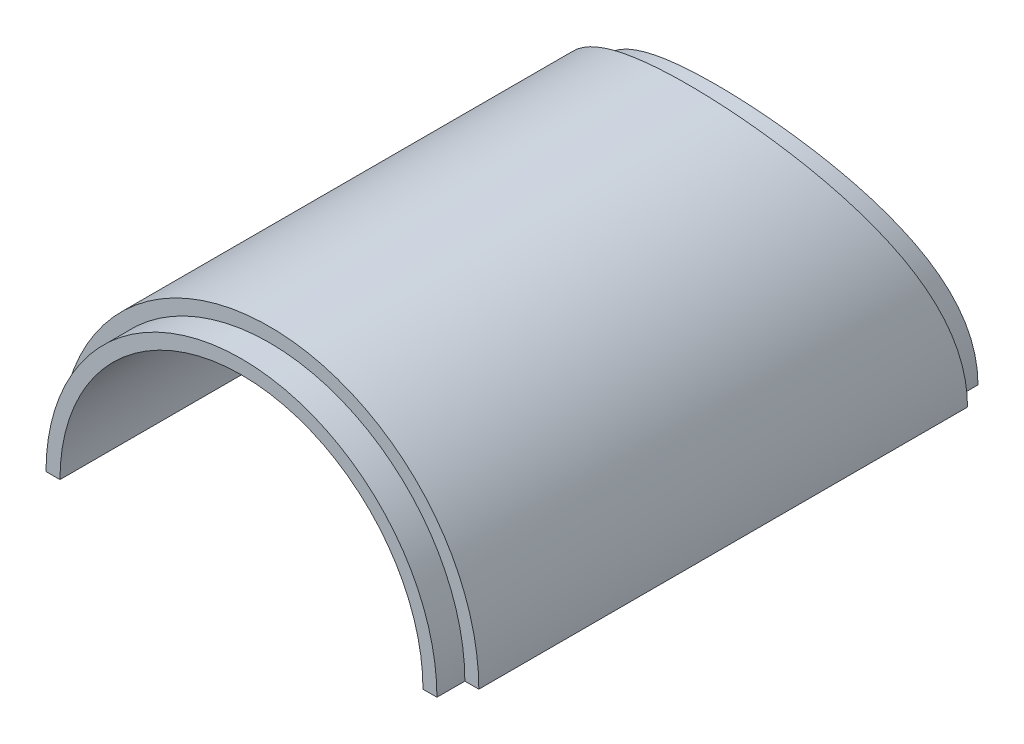
ISO-10303-21;
HEADER;
FILE_DESCRIPTION(('STEP AP214'),'2;1');
FILE_NAME('part.step','',(''),(''),'','','');
FILE_SCHEMA(('AUTOMOTIVE_DESIGN { 1 0 10303 214 1 1 1 1 }'));
ENDSEC;
DATA;
#1=APPLICATION_CONTEXT('core data for automotive mechanical design processes');
#2=APPLICATION_PROTOCOL_DEFINITION('international standard','automotive_design',2000,#1);
#3=PRODUCT_CONTEXT('',#1,'mechanical');
#4=PRODUCT('Part','Part','',(#3));
#5=PRODUCT_RELATED_PRODUCT_CATEGORY('part','',(#4));
#6=PRODUCT_DEFINITION_FORMATION('','',#4);
#7=PRODUCT_DEFINITION_CONTEXT('part definition',#1,'design');
#8=PRODUCT_DEFINITION('design','',#6,#7);
#9=PRODUCT_DEFINITION_SHAPE('','',#8);
#10=(LENGTH_UNIT() NAMED_UNIT(*) SI_UNIT(.MILLI.,.METRE.));
#11=(NAMED_UNIT(*) PLANE_ANGLE_UNIT() SI_UNIT($,.RADIAN.));
#12=(NAMED_UNIT(*) SI_UNIT($,.STERADIAN.) SOLID_ANGLE_UNIT());
#13=UNCERTAINTY_MEASURE_WITH_UNIT(LENGTH_MEASURE(1.E-05),#10,'distance_accuracy_value','');
#14=(GEOMETRIC_REPRESENTATION_CONTEXT(3) GLOBAL_UNCERTAINTY_ASSIGNED_CONTEXT((#13)) GLOBAL_UNIT_ASSIGNED_CONTEXT((#10,
#11,#12)) REPRESENTATION_CONTEXT('',''));
#15=CARTESIAN_POINT('',(0.,0.,0.));
#16=DIRECTION('',(0.,0.,1.));
#17=DIRECTION('',(1.,0.,0.));
#18=AXIS2_PLACEMENT_3D('',#15,#16,#17);
#19=CARTESIAN_POINT('',(18.,0.,30.));
#20=DIRECTION('',(0.,0.,-1.));
#21=DIRECTION('',(-1.,0.,0.));
#22=AXIS2_PLACEMENT_3D('',#19,#20,#21);
#23=CYLINDRICAL_SURFACE('',#22,13.);
#24=CARTESIAN_POINT('',(31.,0.,-6.02633403898971));
#25=CARTESIAN_POINT('',(31.0000016897599,0.1665626375054,-6.02633901590366));
#26=CARTESIAN_POINT('',(30.9967981005822,0.333100402856519,-6.02413977216418));
#27=CARTESIAN_POINT('',(30.9840060721568,0.665806268457435,-6.01538322151869));
#28=CARTESIAN_POINT('',(30.9744180061231,0.831974389745662,-6.00882616935477));
#29=CARTESIAN_POINT('',(30.936142411101,1.32911877765249,-5.98271211152448));
#30=CARTESIAN_POINT('',(30.8979433650229,1.65909284812564,-5.95671199024965));
#31=CARTESIAN_POINT('',(30.7971435870167,2.31111005626171,-5.88883207957934));
#32=CARTESIAN_POINT('',(30.7347193091825,2.63319303475539,-5.84706717802965));
#33=CARTESIAN_POINT('',(30.5863337699486,3.26971056980956,-5.74923155556972));
#34=CARTESIAN_POINT('',(30.500368603231,3.58414384789007,-5.69315846110585));
#35=CARTESIAN_POINT('',(30.3062598279928,4.20245918231171,-5.5688603558023));
#36=CARTESIAN_POINT('',(30.1981864978056,4.50637119016195,-5.50067393950033));
#37=CARTESIAN_POINT('',(29.9607860389006,5.10320975651097,-5.35415974357583));
#38=CARTESIAN_POINT('',(29.8314593991805,5.39613656756756,-5.27583219728995));
#39=CARTESIAN_POINT('',(29.552339131725,5.97039177885703,-5.11106433538175));
#40=CARTESIAN_POINT('',(29.4025078219587,6.25169755400091,-5.0246091771767));
#41=CARTESIAN_POINT('',(29.0835245711221,6.80120814628655,-4.8458711743329));
#42=CARTESIAN_POINT('',(28.9143706427829,7.06941161184105,-4.75358773071102));
#43=CARTESIAN_POINT('',(28.5386323795693,7.61969299452666,-4.55526926282135));
#44=CARTESIAN_POINT('',(28.3299804098726,7.90021009551003,-4.44881590799898));
#45=CARTESIAN_POINT('',(27.8911711587022,8.44313806948932,-4.23405653882863));
#46=CARTESIAN_POINT('',(27.6610125509728,8.70554782411762,-4.12575041056205));
#47=CARTESIAN_POINT('',(27.1800710922708,9.21130366172059,-3.90981742176698));
#48=CARTESIAN_POINT('',(26.9292786126355,9.45464073994581,-3.80219090388758));
#49=CARTESIAN_POINT('',(26.4082428649686,9.92086826045577,-3.59017657541904));
#50=CARTESIAN_POINT('',(26.138005930286,10.1437653070435,-3.48578772598448));
#51=CARTESIAN_POINT('',(25.5531159517618,10.5876058138327,-3.27315021094674));
#52=CARTESIAN_POINT('',(25.2366679533623,10.8064512799416,-3.16544131307976));
#53=CARTESIAN_POINT('',(24.5832969832162,11.2164588172878,-2.95963909553644));
#54=CARTESIAN_POINT('',(24.2463724122839,11.4076187223754,-2.8615465284465));
#55=CARTESIAN_POINT('',(23.5542534950822,11.7601439721249,-2.67785036875791));
#56=CARTESIAN_POINT('',(23.1990699814038,11.9215267278724,-2.59223948414213));
#57=CARTESIAN_POINT('',(22.4727641307415,12.2125907186837,-2.43604023601146));
#58=CARTESIAN_POINT('',(22.1016440687204,12.3422764609666,-2.36544973682833));
#59=CARTESIAN_POINT('',(21.3793365374699,12.5582475892564,-2.24693049867289));
#60=CARTESIAN_POINT('',(21.0292185878105,12.6473247123944,-2.19756573275281));
#61=CARTESIAN_POINT('',(20.3209698830693,12.7962497874654,-2.11462973112151));
#62=CARTESIAN_POINT('',(19.9628395532067,12.8560992866865,-2.08105765936059));
#63=CARTESIAN_POINT('',(19.2418958102183,12.9456384715533,-2.03071213453473));
#64=CARTESIAN_POINT('',(18.8790856844059,12.9753482726294,-2.01392747754568));
#65=CARTESIAN_POINT('',(18.1518765380804,13.0042036269195,-1.99762705076089));
#66=CARTESIAN_POINT('',(17.7874776561049,13.003351793805,-1.99810980423324));
#67=CARTESIAN_POINT('',(17.1007143773861,12.9728967821325,-2.01531083131253));
#68=CARTESIAN_POINT('',(16.7781572349743,12.9464830292522,-2.03022805548849));
#69=CARTESIAN_POINT('',(16.1368095620277,12.869840685398,-2.07333885717449));
#70=CARTESIAN_POINT('',(15.8180186920036,12.8196142579298,-2.10153122856657));
#71=CARTESIAN_POINT('',(15.1863712760725,12.6959472765978,-2.17053550923254));
#72=CARTESIAN_POINT('',(14.8735148604089,12.6225062138657,-2.21134769513427));
#73=CARTESIAN_POINT('',(14.2557113625439,12.4532284255321,-2.30467196336632));
#74=CARTESIAN_POINT('',(13.9507645943,12.3573908124517,-2.35718450932774));
#75=CARTESIAN_POINT('',(13.3477153461669,12.1432940294828,-2.47331740781799));
#76=CARTESIAN_POINT('',(13.0497038771189,12.0248330090265,-2.53703731586566));
#77=CARTESIAN_POINT('',(12.4650529271984,11.7671756310051,-2.67390514630102));
#78=CARTESIAN_POINT('',(12.1784133793764,11.6279793955365,-2.7470530131731));
#79=CARTESIAN_POINT('',(11.6177695292237,11.3299571058375,-2.90131963750946));
#80=CARTESIAN_POINT('',(11.3437656584262,11.171130381868,-2.98243866690889));
#81=CARTESIAN_POINT('',(10.8093777513921,10.8348815828958,-3.15112128386189));
#82=CARTESIAN_POINT('',(10.5489986554538,10.6574528319479,-3.23868718170454));
#83=CARTESIAN_POINT('',(10.0146656080873,10.2643243865529,-3.42864119233119));
#84=CARTESIAN_POINT('',(9.74242741796964,10.0465631002257,-3.5315941576997));
#85=CARTESIAN_POINT('',(9.21706319464227,9.59067295329139,-3.74111901265646));
#86=CARTESIAN_POINT('',(8.96393858028746,9.35254258342249,-3.84769117005793));
#87=CARTESIAN_POINT('',(8.47747464001389,8.85676429334143,-4.06218104620757));
#88=CARTESIAN_POINT('',(8.24416118900117,8.59909165589988,-4.17010031974955));
#89=CARTESIAN_POINT('',(7.79866097346388,8.06557314005327,-4.38462187008644));
#90=CARTESIAN_POINT('',(7.58647455945219,7.7897269602621,-4.49122412500537));
#91=CARTESIAN_POINT('',(7.16473314966819,7.19326228905223,-4.71062262472548));
#92=CARTESIAN_POINT('',(6.95743101200354,6.87089654953278,-4.82301628597622));
#93=CARTESIAN_POINT('',(6.57100454233869,6.20690110002932,-5.03936057342372));
#94=CARTESIAN_POINT('',(6.39188446466687,5.86526849209713,-5.14330992373448));
#95=CARTESIAN_POINT('',(6.06404687060864,5.16545369048354,-5.33863305325222));
#96=CARTESIAN_POINT('',(5.91524679878186,4.80731978161764,-5.43004075279637));
#97=CARTESIAN_POINT('',(5.6493589389598,4.07589514067057,-5.59674399352012));
#98=CARTESIAN_POINT('',(5.53225841776292,3.70261056386417,-5.67204600153897));
#99=CARTESIAN_POINT('',(5.36114358028954,3.05549728015838,-5.78369370478997));
#100=CARTESIAN_POINT('',(5.29870477824631,2.78471778209582,-5.82498268493458));
#101=CARTESIAN_POINT('',(5.19112916992478,2.23837170787368,-5.89667581388156));
#102=CARTESIAN_POINT('',(5.14598726632008,1.96280656708605,-5.92708316928025));
#103=CARTESIAN_POINT('',(5.07331596196158,1.40701167834294,-5.97625457422913));
#104=CARTESIAN_POINT('',(5.04586942897651,1.12676619912327,-5.99496382919016));
#105=CARTESIAN_POINT('',(5.00918695822563,0.564358071791138,-6.02004044352229));
#106=CARTESIAN_POINT('',(4.99996286568158,0.282194296200175,-6.0263997749669));
#107=CARTESIAN_POINT('',(5.,0.,-6.02633403898972));
#108=B_SPLINE_CURVE_WITH_KNOTS('',3,(#24,#25,#26,#27,#28,#29,#30,#31,#32,#33,#34,#35,#36,#37,
#38,#39,#40,#41,#42,#43,#44,#45,#46,#47,#48,#49,#50,#51,#52,#53,#54,#55,#56,#57,#58,#59,#60,#61,
#62,#63,#64,#65,#66,#67,#68,#69,#70,#71,#72,#73,#74,#75,#76,#77,#78,#79,#80,#81,#82,#83,#84,#85,
#86,#87,#88,#89,#90,#91,#92,#93,#94,#95,#96,#97,#98,#99,#100,#101,#102,#103,#104,#105,#106,
#107),.UNSPECIFIED.,.F.,.F.,(4,2,2,2,2,2,2,2,2,2,2,2,2,2,2,2,2,2,2,2,2,2,2,2,2,2,2,2,2,2,2,2,2,
2,2,2,2,2,2,2,2,4),(0.,0.499593649530141,0.999158097146907,1.99721783262201,2.98814027244345,
3.97922720112513,4.96721125906003,5.95517258856695,6.94497453427897,7.934878369732,
9.03012486179041,10.1254389393399,11.2212670690329,12.3167398729281,13.5138004021102,
14.7109545401237,15.9074064528386,17.1036881346139,18.1960368873684,19.2883278057443,
20.3798892415058,21.4713573257047,22.442142721634,23.4128399335438,24.3835584247614,
25.3543153879011,26.334176572416,27.3140319873785,28.2939208415911,29.2741625725871,
30.363530540065,31.4529792950782,32.5438297426824,33.6346982852719,34.8314096816296,
36.028301559063,37.2218896553505,38.4149975925911,39.2570933048917,40.0989406637591,
40.9447023117082,41.791013553559),.UNSPECIFIED.);
#109=CARTESIAN_POINT('',(31.,0.,-6.02633403898972));
#110=VERTEX_POINT('',#109);
#111=CARTESIAN_POINT('',(5.,0.,-6.02633403898972));
#112=VERTEX_POINT('',#111);
#113=EDGE_CURVE('E117',#110,#112,#108,.T.);
#114=ORIENTED_EDGE('',*,*,#113,.F.);
#115=DIRECTION('',(0.,0.,-1.));
#116=VECTOR('',#115,1.);
#117=CARTESIAN_POINT('',(31.,0.,30.));
#118=LINE('',#117,#116);
#119=CARTESIAN_POINT('',(31.,0.,32.));
#120=VERTEX_POINT('',#119);
#121=EDGE_CURVE('E124',#120,#110,#118,.T.);
#122=ORIENTED_EDGE('',*,*,#121,.F.);
#123=CARTESIAN_POINT('',(18.,0.,32.));
#124=DIRECTION('',(0.,0.,-1.));
#125=DIRECTION('',(-1.,0.,0.));
#126=AXIS2_PLACEMENT_3D('',#123,#124,#125);
#127=CIRCLE('',#126,13.);
#128=CARTESIAN_POINT('',(5.,0.,32.));
#129=VERTEX_POINT('',#128);
#130=EDGE_CURVE('E195',#129,#120,#127,.T.);
#131=ORIENTED_EDGE('',*,*,#130,.F.);
#132=DIRECTION('',(0.,0.,-1.));
#133=VECTOR('',#132,1.);
#134=CARTESIAN_POINT('',(5.,0.,30.));
#135=LINE('',#134,#133);
#136=EDGE_CURVE('E126',#129,#112,#135,.T.);
#137=ORIENTED_EDGE('',*,*,#136,.T.);
#138=EDGE_LOOP('',(#114,#122,#131,#137));
#139=FACE_BOUND('',#138,.T.);
#140=ADVANCED_FACE('F44',(#139),#23,.F.);
#141=CARTESIAN_POINT('',(18.,0.,-10.));
#142=DIRECTION('',(0.,0.,1.));
#143=DIRECTION('',(1.,0.,0.));
#144=AXIS2_PLACEMENT_3D('',#141,#142,#143);
#145=CYLINDRICAL_SURFACE('',#144,14.);
#146=DIRECTION('',(0.,0.,1.));
#147=VECTOR('',#146,1.);
#148=CARTESIAN_POINT('',(32.,0.,-10.));
#149=LINE('',#148,#147);
#150=CARTESIAN_POINT('',(32.,0.,-6.75171240910533));
#151=VERTEX_POINT('',#150);
#152=CARTESIAN_POINT('',(32.,0.,-4.28768482279202));
#153=VERTEX_POINT('',#152);
#154=EDGE_CURVE('E74',#151,#153,#149,.T.);
#155=ORIENTED_EDGE('',*,*,#154,.F.);
#156=CARTESIAN_POINT('',(32.,0.,-6.75171240910533));
#157=CARTESIAN_POINT('',(32.0000021968107,0.176421937137582,-6.75171876012938));
#158=CARTESIAN_POINT('',(31.9966643589592,0.352816343396993,-6.74915277524469));
#159=CARTESIAN_POINT('',(31.98333947145,0.70519388857985,-6.73893977438069));
#160=CARTESIAN_POINT('',(31.973352908764,0.881177056676325,-6.73129313052357));
#161=CARTESIAN_POINT('',(31.9334991771646,1.40757177891328,-6.70085267501273));
#162=CARTESIAN_POINT('',(31.8937377949942,1.75687476967663,-6.67055801979273));
#163=CARTESIAN_POINT('',(31.7889592542077,2.44649185415436,-6.59161018140486));
#164=CARTESIAN_POINT('',(31.7241525772723,2.78685625886891,-6.54311009245933));
#165=CARTESIAN_POINT('',(31.5702700167902,3.45930218178935,-6.42967700606591));
#166=CARTESIAN_POINT('',(31.4811890193407,3.79138193854831,-6.36474054615162));
#167=CARTESIAN_POINT('',(31.2803157171983,4.44402127356039,-6.22106609334012));
#168=CARTESIAN_POINT('',(31.16861362301,4.76462083691615,-6.14238308617643));
#169=CARTESIAN_POINT('',(30.9235141154373,5.39416206630367,-5.97357185401565));
#170=CARTESIAN_POINT('',(30.7901174076697,5.70310411109355,-5.88344400128289));
#171=CARTESIAN_POINT('',(30.3582969622337,6.61233239885659,-5.59920006105831));
#172=CARTESIAN_POINT('',(30.0285718803998,7.19396643094696,-5.39147003770921));
#173=CARTESIAN_POINT('',(29.4547705605446,8.05779529344023,-5.053923384729));
#174=CARTESIAN_POINT('',(29.2362211142597,8.35978329311948,-4.9297224906125));
#175=CARTESIAN_POINT('',(28.7762013856779,8.94493443552506,-4.67902529216146));
#176=CARTESIAN_POINT('',(28.5347297530711,9.22809646757033,-4.55252885295543));
#177=CARTESIAN_POINT('',(28.0297980958994,9.77454004410221,-4.30017239761919));
#178=CARTESIAN_POINT('',(27.7663310593178,10.0378151974161,-4.17431259811264));
#179=CARTESIAN_POINT('',(27.2183535424325,10.5432865848155,-3.92602450857523));
#180=CARTESIAN_POINT('',(26.9338419554464,10.7854817088927,-3.80359639947628));
#181=CARTESIAN_POINT('',(26.3115125757093,11.2735192461748,-3.55136845910555));
#182=CARTESIAN_POINT('',(25.9713009179924,11.5166961406773,-3.42229297959555));
#183=CARTESIAN_POINT('',(25.2675572681554,11.9732421559647,-3.17520477478402));
#184=CARTESIAN_POINT('',(24.904023069529,12.1866084503326,-3.05719309881764));
#185=CARTESIAN_POINT('',(24.1559136951308,12.5810731501207,-2.83568670551753));
#186=CARTESIAN_POINT('',(23.7713525245015,12.7621926995679,-2.73218248526284));
#187=CARTESIAN_POINT('',(22.9836272707718,13.0898944431034,-2.54276402524643));
#188=CARTESIAN_POINT('',(22.5804663712878,13.2364825217244,-2.45684678880174));
#189=CARTESIAN_POINT('',(21.7989927204699,13.4802991706491,-2.3127837907364));
#190=CARTESIAN_POINT('',(21.422095060607,13.580948810923,-2.25274598940981));
#191=CARTESIAN_POINT('',(20.6588314620542,13.7507604775927,-2.15095665396675));
#192=CARTESIAN_POINT('',(20.2724660855942,13.8199243689828,-2.10920403677013));
#193=CARTESIAN_POINT('',(19.4940060680346,13.9255921626921,-2.04525433037893));
#194=CARTESIAN_POINT('',(19.1019163433853,13.9621225881595,-2.02304136038231));
#195=CARTESIAN_POINT('',(18.3154457806506,14.0019809129268,-1.99879986154157));
#196=CARTESIAN_POINT('',(17.9210651903685,14.0053123388284,-1.99676918880985));
#197=CARTESIAN_POINT('',(17.184168402273,13.9804322927633,-2.01190671739623));
#198=CARTESIAN_POINT('',(16.8414593267018,13.9561938478802,-2.02665674775835));
#199=CARTESIAN_POINT('',(16.1597454450919,13.8827577700359,-2.07119485822941));
#200=CARTESIAN_POINT('',(15.8207402494904,13.8335627882511,-2.10098134098818));
#201=CARTESIAN_POINT('',(15.1487615905573,13.710839334113,-2.17491026653771));
#202=CARTESIAN_POINT('',(14.8157883379247,13.6373100134706,-2.21905320979029));
#203=CARTESIAN_POINT('',(14.1579974072177,13.4667913965717,-2.32071897240971));
#204=CARTESIAN_POINT('',(13.8331800685268,13.3698011258395,-2.37824234754331));
#205=CARTESIAN_POINT('',(13.1920832052669,13.1529080732704,-2.50575048074756));
#206=CARTESIAN_POINT('',(12.8758503904243,13.032900872989,-2.57579192551624));
#207=CARTESIAN_POINT('',(12.2550947145477,12.7714329817864,-2.72674007361506));
#208=CARTESIAN_POINT('',(11.9505717329879,12.6299725117514,-2.80764666507494));
#209=CARTESIAN_POINT('',(11.3545159424966,12.3267740926759,-2.97878979137606));
#210=CARTESIAN_POINT('',(11.0629840184987,12.1650347651197,-3.06902696041797));
#211=CARTESIAN_POINT('',(10.4939711325081,11.8224297839899,-3.25719995440491));
#212=CARTESIAN_POINT('',(10.2164916655806,11.6415621016131,-3.35513659569274));
#213=CARTESIAN_POINT('',(9.64375843747441,11.2387803546126,-3.56923586381799));
#214=CARTESIAN_POINT('',(9.35042138950896,11.0145480292566,-3.68616940881013));
#215=CARTESIAN_POINT('',(8.78353894930871,10.5447800407206,-3.92509828143214));
#216=CARTESIAN_POINT('',(8.50999493485738,10.2992428971336,-4.04709396050644));
#217=CARTESIAN_POINT('',(7.98317704715965,9.78765982613905,-4.29376945611268));
#218=CARTESIAN_POINT('',(7.72993618956037,9.52158182225882,-4.41845324227555));
#219=CARTESIAN_POINT('',(7.24507541262723,8.9703045843095,-4.66761437675304));
#220=CARTESIAN_POINT('',(7.01345656597056,8.68510440278575,-4.79209171452507));
#221=CARTESIAN_POINT('',(6.54587689292741,8.06059638933169,-5.05299044169404));
#222=CARTESIAN_POINT('',(6.312831586911,7.71893169913446,-5.18901705216707));
#223=CARTESIAN_POINT('',(5.87661244643572,7.01393715114273,-5.45291611809423));
#224=CARTESIAN_POINT('',(5.67344345128638,6.65060379686541,-5.58078725064379));
#225=CARTESIAN_POINT('',(5.29944479418037,5.90501961205291,-5.82331040656003));
#226=CARTESIAN_POINT('',(5.12851059218995,5.52283518840637,-5.93800467354258));
#227=CARTESIAN_POINT('',(4.82029456136224,4.74046092786946,-6.14979086628874));
#228=CARTESIAN_POINT('',(4.68300106698721,4.34027738964132,-6.24688889082482));
#229=CARTESIAN_POINT('',(4.47187762426035,3.61893560442763,-6.39885268858235));
#230=CARTESIAN_POINT('',(4.39071371603543,3.30087362709468,-6.45829294057637));
#231=CARTESIAN_POINT('',(4.25060592951068,2.6575329796796,-6.56194760579433));
#232=CARTESIAN_POINT('',(4.19165440522029,2.33225683377184,-6.60616725782905));
#233=CARTESIAN_POINT('',(4.09644016473998,1.67402605087428,-6.67802826744194));
#234=CARTESIAN_POINT('',(4.06034885492967,1.34103237105592,-6.70554431863886));
#235=CARTESIAN_POINT('',(4.0241790144991,0.839414402851077,-6.73318234921867));
#236=CARTESIAN_POINT('',(4.01511688689262,0.671749278643638,-6.74012241683303));
#237=CARTESIAN_POINT('',(4.00302626935257,0.33606398587151,-6.74939021877651));
#238=CARTESIAN_POINT('',(3.99999816236339,0.168043795450191,-6.75171766036889));
#239=CARTESIAN_POINT('',(4.,0.,-6.75171240910533));
#240=B_SPLINE_CURVE_WITH_KNOTS('',3,(#156,#157,#158,#159,#160,#161,#162,#163,#164,#165,#166,
#167,#168,#169,#170,#171,#172,#173,#174,#175,#176,#177,#178,#179,#180,#181,#182,#183,#184,#185,
#186,#187,#188,#189,#190,#191,#192,#193,#194,#195,#196,#197,#198,#199,#200,#201,#202,#203,#204,
#205,#206,#207,#208,#209,#210,#211,#212,#213,#214,#215,#216,#217,#218,#219,#220,#221,#222,#223,
#224,#225,#226,#227,#228,#229,#230,#231,#232,#233,#234,#235,#236,#237,#238,#239),.UNSPECIFIED.,
.F.,.F.,(4,2,2,2,2,2,2,2,2,2,2,2,2,2,2,2,2,2,2,2,2,2,2,2,2,2,2,2,2,2,2,2,2,2,2,2,2,2,2,2,2,4),
(0.,0.52916158017018,1.05828440728417,2.11519684989521,3.16341361627339,4.21185138279664,
5.25618763399643,6.30048992496652,8.39245621490442,9.57035650198043,10.7483262204257,
11.9266729138953,13.1050816179167,14.4163057189356,15.7276540561209,17.0381393565412,
18.3484011744121,19.5307849242618,20.7130986288977,21.8944505206592,23.0756769206246,
24.106086666246,25.1363869725608,26.1667231986795,27.197102228267,28.2322712301785,
29.2674295745485,30.3026583250858,31.337996985007,32.4987127603714,33.6595092550256,
34.8221566089669,35.9848616117212,37.2893681889612,38.5940858355605,39.894496535703,
41.1944556541582,42.1941620657088,43.1935240412879,44.2002932144647,44.7043028418685,
45.2083444548296),.UNSPECIFIED.);
#241=CARTESIAN_POINT('',(4.,0.,-6.75171240910533));
#242=VERTEX_POINT('',#241);
#243=EDGE_CURVE('E11',#151,#242,#240,.T.);
#244=ORIENTED_EDGE('',*,*,#243,.T.);
#245=DIRECTION('',(0.,0.,1.));
#246=VECTOR('',#245,1.);
#247=CARTESIAN_POINT('',(4.,0.,-10.));
#248=LINE('',#247,#246);
#249=CARTESIAN_POINT('',(4.,0.,-4.28768482279203));
#250=VERTEX_POINT('',#249);
#251=EDGE_CURVE('E189',#242,#250,#248,.T.);
#252=ORIENTED_EDGE('',*,*,#251,.T.);
#253=CARTESIAN_POINT('',(4.,0.,-4.28768482279203));
#254=CARTESIAN_POINT('',(3.9999982199858,0.179712121715562,-4.28769007800764));
#255=CARTESIAN_POINT('',(4.00346116053238,0.359397540984565,-4.28534485162012));
#256=CARTESIAN_POINT('',(4.01728914271325,0.71837163972128,-4.27600668565675));
#257=CARTESIAN_POINT('',(4.0276537913122,0.897660341197794,-4.26901401074173));
#258=CARTESIAN_POINT('',(4.06903090610879,1.43407143213369,-4.24116378097871));
#259=CARTESIAN_POINT('',(4.11032666669767,1.79011754336335,-4.21343379898181));
#260=CARTESIAN_POINT('',(4.21931466327232,2.49371907978788,-4.14102319849828));
#261=CARTESIAN_POINT('',(4.28681930451743,2.84131659666113,-4.09646310484241));
#262=CARTESIAN_POINT('',(4.4472998223907,3.52827838381186,-3.99206185300562));
#263=CARTESIAN_POINT('',(4.54027980515176,3.86764131722663,-3.93221823152091));
#264=CARTESIAN_POINT('',(4.75026034288456,4.5350222711638,-3.7995341739483));
#265=CARTESIAN_POINT('',(4.86718685538732,4.86307170459534,-3.72673388852736));
#266=CARTESIAN_POINT('',(5.12406179790763,5.50731176879837,-3.57028198395468));
#267=CARTESIAN_POINT('',(5.26400972059341,5.82350266071263,-3.48663060394131));
#268=CARTESIAN_POINT('',(5.56605259216701,6.44329142708416,-3.3106584063393));
#269=CARTESIAN_POINT('',(5.72818460290512,6.74686709541613,-3.21832316351724));
#270=CARTESIAN_POINT('',(6.07341863651834,7.33992083665433,-3.02739025537063));
#271=CARTESIAN_POINT('',(6.25652841037139,7.62939364208871,-2.92879028135138));
#272=CARTESIAN_POINT('',(6.66284224955657,8.22260355735241,-2.7171224189351));
#273=CARTESIAN_POINT('',(6.88823588629586,8.52468670938576,-2.6036171815771));
#274=CARTESIAN_POINT('',(7.36221473455491,9.10928907050661,-2.37464249434382));
#275=CARTESIAN_POINT('',(7.61080135689827,9.39180708762816,-2.25917292532853));
#276=CARTESIAN_POINT('',(8.13020110726154,9.93623003109396,-2.02897938886586));
#277=CARTESIAN_POINT('',(8.40102453190907,10.1981252969763,-1.91425579367444));
#278=CARTESIAN_POINT('',(8.9636155048052,10.6998018502723,-1.68829428669286));
#279=CARTESIAN_POINT('',(9.25537621034958,10.9395903046074,-1.577055253001));
#280=CARTESIAN_POINT('',(9.88610543708568,11.4164273757687,-1.35075344692393));
#281=CARTESIAN_POINT('',(10.2269565617653,11.6512631986991,-1.23625602379672));
#282=CARTESIAN_POINT('',(10.9305663128592,12.0911223760805,-1.01753079880961));
#283=CARTESIAN_POINT('',(11.2933266104716,12.2961434522331,-0.913303781960335));
#284=CARTESIAN_POINT('',(12.0383701881434,12.6741207450305,-0.718172423358283));
#285=CARTESIAN_POINT('',(12.4206420650359,12.8470954229838,-0.627260417448786));
#286=CARTESIAN_POINT('',(13.2021913213586,13.1589502797429,-0.461448318697107));
#287=CARTESIAN_POINT('',(13.6014663273568,13.2978351988811,-0.386545999824207));
#288=CARTESIAN_POINT('',(14.3789569080993,13.5291605416999,-0.260767934640052));
#289=CARTESIAN_POINT('',(14.7560493169025,13.6245590605632,-0.208384297497392));
#290=CARTESIAN_POINT('',(15.5187706400871,13.7838760184308,-0.120474045792933));
#291=CARTESIAN_POINT('',(15.9043991079612,13.8477960999736,-0.0849465516844959));
#292=CARTESIAN_POINT('',(16.6806237099861,13.9431724140863,-0.0318104596682046));
#293=CARTESIAN_POINT('',(17.0712164406343,13.9746497897717,-0.0141901916130352));
#294=CARTESIAN_POINT('',(17.8540492591162,14.0047166467643,0.00263831907246236));
#295=CARTESIAN_POINT('',(18.2462892070143,14.0033088674244,0.00184809530770356));
#296=CARTESIAN_POINT('',(18.9862560846951,13.9695820845697,-0.0170242129969134));
#297=CARTESIAN_POINT('',(19.3341913250805,13.9406364444673,-0.033219192817002));
#298=CARTESIAN_POINT('',(20.0259643638386,13.8570137035179,-0.0798150370475733));
#299=CARTESIAN_POINT('',(20.3698025244902,13.8023388953137,-0.110214635728795));
#300=CARTESIAN_POINT('',(21.0510455967103,13.6679069292552,-0.184509933242328));
#301=CARTESIAN_POINT('',(21.3884503745895,13.5881492507667,-0.228405912212786));
#302=CARTESIAN_POINT('',(22.0546984206159,13.404433730738,-0.328702424638156));
#303=CARTESIAN_POINT('',(22.3835413511754,13.3004749365665,-0.385103450326544));
#304=CARTESIAN_POINT('',(23.0339651212058,13.0682676096377,-0.509799231846245));
#305=CARTESIAN_POINT('',(23.3554425765133,12.9397899944468,-0.578205627471065));
#306=CARTESIAN_POINT('',(23.9860859316291,12.6604000653739,-0.725082665279604));
#307=CARTESIAN_POINT('',(24.2952518981868,12.5094878731466,-0.803553252888455));
#308=CARTESIAN_POINT('',(24.8999429287278,12.1863991019394,-0.968997782456993));
#309=CARTESIAN_POINT('',(25.1954657010255,12.0142189682482,-1.05597314539235));
#310=CARTESIAN_POINT('',(25.7716833690317,11.649771581104,-1.23674807326462));
#311=CARTESIAN_POINT('',(26.0523765893444,11.4575020652921,-1.33054840643133));
#312=CARTESIAN_POINT('',(26.6280088942174,11.0317428677732,-1.53384134699445));
#313=CARTESIAN_POINT('',(26.9211087878536,10.7960456606287,-1.64392409291705));
#314=CARTESIAN_POINT('',(27.4866305350164,10.3026541340172,-1.8678501609404));
#315=CARTESIAN_POINT('',(27.759051011717,10.0449583523178,-1.98169373271226));
#316=CARTESIAN_POINT('',(28.2824659209902,9.50849656620682,-2.21069118900346));
#317=CARTESIAN_POINT('',(28.53343283974,9.22970434439313,-2.32584654768842));
#318=CARTESIAN_POINT('',(29.0124770235798,8.65251498548233,-2.55460371872216));
#319=CARTESIAN_POINT('',(29.2405544177571,8.35411795896377,-2.66820553982911));
#320=CARTESIAN_POINT('',(29.693058633945,7.70983684796129,-2.90151294646805));
#321=CARTESIAN_POINT('',(29.9151185245847,7.36212719519498,-3.020785717046));
#322=CARTESIAN_POINT('',(30.3288476068488,6.64608847332084,-3.25016094044777));
#323=CARTESIAN_POINT('',(30.5205122555918,6.27775633308047,-3.36026202130307));
#324=CARTESIAN_POINT('',(30.8710687390636,5.52341377301368,-3.56692039309678));
#325=CARTESIAN_POINT('',(31.0300476684968,5.13745377299359,-3.66351345181052));
#326=CARTESIAN_POINT('',(31.3138189449224,4.34941567804447,-3.83941968690911));
#327=CARTESIAN_POINT('',(31.4386251612053,3.94734419827779,-3.91873987095568));
#328=CARTESIAN_POINT('',(31.6199245823072,3.2534205511945,-4.03561374500121));
#329=CARTESIAN_POINT('',(31.6856705577391,2.9648565941174,-4.07855101633852));
#330=CARTESIAN_POINT('',(31.7989216931348,2.38277735200848,-4.15307351997656));
#331=CARTESIAN_POINT('',(31.8464321716268,2.08926353675423,-4.18466206205257));
#332=CARTESIAN_POINT('',(31.9228925103842,1.49746306849928,-4.23572024067655));
#333=CARTESIAN_POINT('',(31.9517604713556,1.19916117713009,-4.25513639138297));
#334=CARTESIAN_POINT('',(31.9903389284007,0.600583671139726,-4.28115561497675));
#335=CARTESIAN_POINT('',(32.0000375318747,0.300306947153606,-4.28775073370068));
#336=CARTESIAN_POINT('',(32.,0.,-4.28768482279202));
#337=B_SPLINE_CURVE_WITH_KNOTS('',3,(#253,#254,#255,#256,#257,#258,#259,#260,#261,#262,#263,
#264,#265,#266,#267,#268,#269,#270,#271,#272,#273,#274,#275,#276,#277,#278,#279,#280,#281,#282,
#283,#284,#285,#286,#287,#288,#289,#290,#291,#292,#293,#294,#295,#296,#297,#298,#299,#300,#301,
#302,#303,#304,#305,#306,#307,#308,#309,#310,#311,#312,#313,#314,#315,#316,#317,#318,#319,#320,
#321,#322,#323,#324,#325,#326,#327,#328,#329,#330,#331,#332,#333,#334,#335,#336),.UNSPECIFIED.,
.F.,.F.,(4,2,2,2,2,2,2,2,2,2,2,2,2,2,2,2,2,2,2,2,2,2,2,2,2,2,2,2,2,2,2,2,2,2,2,2,2,2,2,2,2,4),
(0.,0.539035143676227,1.07803959324794,2.15491669047742,3.22422387482271,4.29370351232145,
5.35992494385221,6.42612288179345,7.49412432161499,8.56252165289051,9.74218349479975,
10.9219171420923,12.1022001729211,13.2820992061404,14.5688024003709,15.8556038666108,
17.141661710624,18.4275406211417,19.6033422737761,20.7790825668127,21.9540561370654,
23.1289318316712,24.176223508821,25.2234218828686,26.2706419945979,27.3179033351489,
28.3754761906817,29.4330433115802,30.4907874334236,31.5486508014141,32.7230981647541,
33.8976236538029,35.0736335336992,36.2496367810216,37.5363986153785,38.8233525886348,
40.1068315695605,41.3897888647188,42.2862245403995,43.1823985644255,44.0824833002844,
44.9831262703909),.UNSPECIFIED.);
#338=EDGE_CURVE('E60',#250,#153,#337,.T.);
#339=ORIENTED_EDGE('',*,*,#338,.T.);
#340=EDGE_LOOP('',(#155,#244,#252,#339));
#341=FACE_BOUND('',#340,.T.);
#342=ADVANCED_FACE('F157',(#341),#145,.T.);
#343=CARTESIAN_POINT('',(18.,0.,30.));
#344=DIRECTION('',(0.,0.,-1.));
#345=DIRECTION('',(-1.,0.,0.));
#346=AXIS2_PLACEMENT_3D('',#343,#344,#345);
#347=CYLINDRICAL_SURFACE('',#346,15.);
#348=CARTESIAN_POINT('',(3.,0.,-5.));
#349=CARTESIAN_POINT('',(2.99999772582751,0.189678756574019,-5.00000657668593));
#350=CARTESIAN_POINT('',(3.00359870845433,0.379328207186624,-4.99730039649391));
#351=CARTESIAN_POINT('',(3.01797482693308,0.758189575745024,-4.98652853828002));
#352=CARTESIAN_POINT('',(3.02874946037155,0.94740152340057,-4.97846323558947));
#353=CARTESIAN_POINT('',(3.07175110400067,1.51339255656855,-4.94635318284411));
#354=CARTESIAN_POINT('',(3.11465602963252,1.88899081133793,-4.91439396765199));
#355=CARTESIAN_POINT('',(3.2277515885044,2.63065758763823,-4.83107566095662));
#356=CARTESIAN_POINT('',(3.29772111306819,2.99677831844653,-4.77987386873523));
#357=CARTESIAN_POINT('',(3.46390012463523,3.72015605388242,-4.66008166202752));
#358=CARTESIAN_POINT('',(3.56011488299561,4.07741126212608,-4.59148775452886));
#359=CARTESIAN_POINT('',(3.77713955620045,4.77962090888493,-4.43965800788119));
#360=CARTESIAN_POINT('',(3.89785605312464,5.12461638792572,-4.35647794063826));
#361=CARTESIAN_POINT('',(4.16278705451125,5.80206364008177,-4.17796603445494));
#362=CARTESIAN_POINT('',(4.30700084485689,6.1345157940288,-4.08263456483243));
#363=CARTESIAN_POINT('',(4.77389243504494,7.11283766322664,-3.78192082335153));
#364=CARTESIAN_POINT('',(5.1304816162148,7.73859093754846,-3.56206751639106));
#365=CARTESIAN_POINT('',(5.75032129346012,8.66640322011135,-3.20523675933287));
#366=CARTESIAN_POINT('',(5.98584260898354,8.98998604471408,-3.0742384550804));
#367=CARTESIAN_POINT('',(6.48151234925762,9.61685724800044,-2.80983905282157));
#368=CARTESIAN_POINT('',(6.74166219613062,9.9201444530285,-2.67643781642355));
#369=CARTESIAN_POINT('',(7.28555949705997,10.5052567311006,-2.4103457155075));
#370=CARTESIAN_POINT('',(7.56931434220451,10.7870750285819,-2.27765508743932));
#371=CARTESIAN_POINT('',(8.15937534896768,11.3279420042285,-2.01595609913203));
#372=CARTESIAN_POINT('',(8.46568264736324,11.5869895331667,-1.88694792496582));
#373=CARTESIAN_POINT('',(9.13417918823186,12.10766829314,-1.62180263990541));
#374=CARTESIAN_POINT('',(9.49882659155742,12.3665348318522,-1.48640898644757));
#375=CARTESIAN_POINT('',(10.2528221470336,12.8523287683035,-1.22732364887116));
#376=CARTESIAN_POINT('',(10.6421725497749,13.0792532498514,-1.10363303353405));
#377=CARTESIAN_POINT('',(11.4431088893023,13.4985684732726,-0.871575372204092));
#378=CARTESIAN_POINT('',(11.8546803443375,13.690981361648,-0.763198508738496));
#379=CARTESIAN_POINT('',(12.6974292105496,14.038890696975,-0.56498413877379));
#380=CARTESIAN_POINT('',(13.1286033838097,14.1943932144609,-0.475143583983728));
#381=CARTESIAN_POINT('',(13.9650523775788,14.4531014715326,-0.324461742108098));
#382=CARTESIAN_POINT('',(14.3688714764645,14.5598820070592,-0.261671087322482));
#383=CARTESIAN_POINT('',(15.1864637534445,14.7397134851588,-0.155405481222787));
#384=CARTESIAN_POINT('',(15.6002363529641,14.812766383283,-0.111929410041545));
#385=CARTESIAN_POINT('',(16.4337641832967,14.9239255704681,-0.0456102940179202));
#386=CARTESIAN_POINT('',(16.853514481703,14.9620591481326,-0.0227511377665561));
#387=CARTESIAN_POINT('',(17.6953377431731,15.0028231333877,0.00168840285927246));
#388=CARTESIAN_POINT('',(18.117410465558,15.005457153063,0.00327095213127669));
#389=CARTESIAN_POINT('',(18.9074483906647,14.9770774734986,-0.0137483442336472));
#390=CARTESIAN_POINT('',(19.2756248177998,14.9502010105816,-0.0298684070442291));
#391=CARTESIAN_POINT('',(20.0079319040013,14.8695618198044,-0.078065537701875));
#392=CARTESIAN_POINT('',(20.3720629759462,14.8158018619916,-0.110140961523358));
#393=CARTESIAN_POINT('',(21.0937848152162,14.682071077289,-0.18951187719463));
#394=CARTESIAN_POINT('',(21.4513753739424,14.6020994159534,-0.236807853587729));
#395=CARTESIAN_POINT('',(22.1577411992591,14.4168830778661,-0.345570340247896));
#396=CARTESIAN_POINT('',(22.5065161020395,14.3116373599644,-0.407037434281781));
#397=CARTESIAN_POINT('',(23.1952085692208,14.0763273934781,-0.543227168110282));
#398=CARTESIAN_POINT('',(23.535064120552,13.9461247408312,-0.618023557679142));
#399=CARTESIAN_POINT('',(24.2021144036657,13.6625449172759,-0.779109857206174));
#400=CARTESIAN_POINT('',(24.5293092536244,13.5091679627442,-0.865399659850325));
#401=CARTESIAN_POINT('',(25.1696593681717,13.1804978033244,-1.04782191954638));
#402=CARTESIAN_POINT('',(25.4828133783978,13.0052026456151,-1.14395525347782));
#403=CARTESIAN_POINT('',(26.0939204759426,12.6339346728776,-1.344305539907));
#404=CARTESIAN_POINT('',(26.3918719727687,12.4379597008732,-1.44852333534119));
#405=CARTESIAN_POINT('',(27.0062028765034,12.0019418827936,-1.67602096384239));
#406=CARTESIAN_POINT('',(27.3205397787464,11.7594309697149,-1.80009157929568));
#407=CARTESIAN_POINT('',(27.9278361628604,11.2514365414271,-2.05340233828833));
#408=CARTESIAN_POINT('',(28.2207941662574,10.9859514401902,-2.18264283839997));
#409=CARTESIAN_POINT('',(28.7847702291493,10.4328782374807,-2.44372754455535));
#410=CARTESIAN_POINT('',(29.0557540011084,10.1452569085335,-2.5755754349823));
#411=CARTESIAN_POINT('',(29.5743049569587,9.54942337722652,-2.83877181036463));
#412=CARTESIAN_POINT('',(29.8218710401273,9.24121020813074,-2.97012027156667));
#413=CARTESIAN_POINT('',(30.3201038932114,8.56797759532276,-3.24442528450183));
#414=CARTESIAN_POINT('',(30.5677534776962,8.20052844938811,-3.38694508045539));
#415=CARTESIAN_POINT('',(30.9150348593989,7.63224588383907,-3.59392443771289));
#416=CARTESIAN_POINT('',(31.0267729750286,7.43994708972732,-3.66179052142946));
#417=CARTESIAN_POINT('',(31.2420170965758,7.04972744716604,-3.79469448303555));
#418=CARTESIAN_POINT('',(31.3455195996232,6.85180425454015,-3.8597311522102));
#419=CARTESIAN_POINT('',(31.642537240892,6.25140626339248,-4.0491956859739));
#420=CARTESIAN_POINT('',(31.8234073546498,5.84092315947126,-4.16848836532521));
#421=CARTESIAN_POINT('',(32.1489156027539,5.00108534715273,-4.38818710123206));
#422=CARTESIAN_POINT('',(32.2935677574487,4.57173801718772,-4.48860046240684));
#423=CARTESIAN_POINT('',(32.5136972155553,3.80404923616599,-4.64401758930342));
#424=CARTESIAN_POINT('',(32.5974407758558,3.46909627721564,-4.70412210085511));
#425=CARTESIAN_POINT('',(32.7419369793232,2.79196696840874,-4.80883166306768));
#426=CARTESIAN_POINT('',(32.8026972037675,2.44979303984928,-4.85344182429318));
#427=CARTESIAN_POINT('',(32.9007634965381,1.75786987181143,-4.92586172309944));
#428=CARTESIAN_POINT('',(32.9379071550868,1.40808492887578,-4.95355507475701));
#429=CARTESIAN_POINT('',(32.975125249613,0.881304724228874,-4.98136290724332));
#430=CARTESIAN_POINT('',(32.9844484124152,0.705261091474476,-4.98834354135469));
#431=CARTESIAN_POINT('',(32.9968868739996,0.352819455624777,-4.99766472512596));
#432=CARTESIAN_POINT('',(33.0000017218842,0.176421427721725,-5.00000493776111));
#433=CARTESIAN_POINT('',(33.,0.,-5.));
#434=B_SPLINE_CURVE_WITH_KNOTS('',3,(#348,#349,#350,#351,#352,#353,#354,#355,#356,#357,#358,
#359,#360,#361,#362,#363,#364,#365,#366,#367,#368,#369,#370,#371,#372,#373,#374,#375,#376,#377,
#378,#379,#380,#381,#382,#383,#384,#385,#386,#387,#388,#389,#390,#391,#392,#393,#394,#395,#396,
#397,#398,#399,#400,#401,#402,#403,#404,#405,#406,#407,#408,#409,#410,#411,#412,#413,#414,#415,
#416,#417,#418,#419,#420,#421,#422,#423,#424,#425,#426,#427,#428,#429,#430,#431,#432,#433),
.UNSPECIFIED.,.F.,.F.,(4,2,2,2,2,2,2,2,2,2,2,2,2,2,2,2,2,2,2,2,2,2,2,2,2,2,2,2,2,2,2,2,2,2,2,2,
2,2,2,2,2,2,4),(0.,0.568925267949211,1.13781069486677,2.27419522025854,3.40148553722705,
4.52900243746401,5.65229858426095,6.77556059882644,9.02553193233928,10.2879436239694,
11.5504282553996,12.8133096889288,14.0762548227833,15.4761223506732,16.8761175984976,
18.2752112130968,19.6740745634216,20.9394284288849,22.2047089190548,23.4689997772084,
24.7331619926283,25.84036043204,26.9474448103771,28.0545644360156,29.1617296766319,
30.2752225360126,31.3887049994371,32.5022867403275,33.6159847466723,34.8625545937966,
36.1092105668776,37.3577757597926,38.6063996109984,40.0009081139128,40.6982998584768,
41.3959866578982,42.7862894071225,44.1760531206852,45.2263360521387,46.2762722347927,
47.3333528249477,47.8624896253484,48.3916648545152),.UNSPECIFIED.);
#435=CARTESIAN_POINT('',(3.,0.,-5.));
#436=VERTEX_POINT('',#435);
#437=CARTESIAN_POINT('',(33.,0.,-5.));
#438=VERTEX_POINT('',#437);
#439=EDGE_CURVE('E221',#436,#438,#434,.T.);
#440=ORIENTED_EDGE('',*,*,#439,.F.);
#441=DIRECTION('',(0.,0.,-1.));
#442=VECTOR('',#441,1.);
#443=CARTESIAN_POINT('',(3.,0.,30.));
#444=LINE('',#443,#442);
#445=CARTESIAN_POINT('',(3.,0.,30.));
#446=VERTEX_POINT('',#445);
#447=EDGE_CURVE('E138',#446,#436,#444,.T.);
#448=ORIENTED_EDGE('',*,*,#447,.F.);
#449=CARTESIAN_POINT('',(18.,0.,30.));
#450=DIRECTION('',(0.,0.,1.));
#451=DIRECTION('',(-1.,0.,0.));
#452=AXIS2_PLACEMENT_3D('',#449,#450,#451);
#453=CIRCLE('',#452,15.);
#454=CARTESIAN_POINT('',(33.,0.,30.));
#455=VERTEX_POINT('',#454);
#456=EDGE_CURVE('E229',#455,#446,#453,.T.);
#457=ORIENTED_EDGE('',*,*,#456,.F.);
#458=DIRECTION('',(0.,0.,-1.));
#459=VECTOR('',#458,1.);
#460=CARTESIAN_POINT('',(33.,0.,30.));
#461=LINE('',#460,#459);
#462=EDGE_CURVE('E134',#455,#438,#461,.T.);
#463=ORIENTED_EDGE('',*,*,#462,.T.);
#464=EDGE_LOOP('',(#440,#448,#457,#463));
#465=FACE_BOUND('',#464,.T.);
#466=ADVANCED_FACE('F46',(#465),#347,.T.);
#467=CARTESIAN_POINT('',(3.,0.,30.));
#468=DIRECTION('',(0.,1.,0.));
#469=DIRECTION('',(0.,0.,1.));
#470=AXIS2_PLACEMENT_3D('',#467,#468,#469);
#471=PLANE('',#470);
#472=CARTESIAN_POINT('',(18.,0.,-25.));
#473=DIRECTION('',(0.,1.,0.));
#474=DIRECTION('',(0.,0.,1.));
#475=AXIS2_PLACEMENT_3D('',#472,#473,#474);
#476=CIRCLE('',#475,23.);
#477=EDGE_CURVE('E67',#242,#112,#476,.T.);
#478=ORIENTED_EDGE('',*,*,#477,.T.);
#479=ORIENTED_EDGE('',*,*,#136,.F.);
#480=DIRECTION('',(1.,0.,0.));
#481=VECTOR('',#480,1.);
#482=CARTESIAN_POINT('',(4.,0.,32.));
#483=LINE('',#482,#481);
#484=CARTESIAN_POINT('',(4.,0.,32.));
#485=VERTEX_POINT('',#484);
#486=EDGE_CURVE('E203',#485,#129,#483,.T.);
#487=ORIENTED_EDGE('',*,*,#486,.F.);
#488=DIRECTION('',(0.,0.,-1.));
#489=VECTOR('',#488,1.);
#490=CARTESIAN_POINT('',(4.,0.,32.));
#491=LINE('',#490,#489);
#492=CARTESIAN_POINT('',(4.,0.,30.));
#493=VERTEX_POINT('',#492);
#494=EDGE_CURVE('E207',#485,#493,#491,.T.);
#495=ORIENTED_EDGE('',*,*,#494,.T.);
#496=DIRECTION('',(1.,0.,0.));
#497=VECTOR('',#496,1.);
#498=CARTESIAN_POINT('',(3.,0.,30.));
#499=LINE('',#498,#497);
#500=EDGE_CURVE('E233',#446,#493,#499,.T.);
#501=ORIENTED_EDGE('',*,*,#500,.F.);
#502=ORIENTED_EDGE('',*,*,#447,.T.);
#503=CARTESIAN_POINT('',(18.,0.,-25.));
#504=DIRECTION('',(0.,1.,0.));
#505=DIRECTION('',(0.,0.,1.));
#506=AXIS2_PLACEMENT_3D('',#503,#504,#505);
#507=CIRCLE('',#506,25.);
#508=EDGE_CURVE('E217',#436,#250,#507,.T.);
#509=ORIENTED_EDGE('',*,*,#508,.T.);
#510=ORIENTED_EDGE('',*,*,#251,.F.);
#511=EDGE_LOOP('',(#478,#479,#487,#495,#501,#502,#509,#510));
#512=FACE_BOUND('',#511,.T.);
#513=ADVANCED_FACE('F183',(#512),#471,.F.);
#514=CARTESIAN_POINT('',(31.,0.,30.));
#515=DIRECTION('',(0.,1.,0.));
#516=DIRECTION('',(0.,0.,1.));
#517=AXIS2_PLACEMENT_3D('',#514,#515,#516);
#518=PLANE('',#517);
#519=EDGE_CURVE('E114',#110,#151,#476,.T.);
#520=ORIENTED_EDGE('',*,*,#519,.T.);
#521=ORIENTED_EDGE('',*,*,#154,.T.);
#522=EDGE_CURVE('E218',#153,#438,#507,.T.);
#523=ORIENTED_EDGE('',*,*,#522,.T.);
#524=ORIENTED_EDGE('',*,*,#462,.F.);
#525=DIRECTION('',(1.,0.,0.));
#526=VECTOR('',#525,1.);
#527=CARTESIAN_POINT('',(31.,0.,30.));
#528=LINE('',#527,#526);
#529=CARTESIAN_POINT('',(32.,0.,30.));
#530=VERTEX_POINT('',#529);
#531=EDGE_CURVE('E141',#530,#455,#528,.T.);
#532=ORIENTED_EDGE('',*,*,#531,.F.);
#533=DIRECTION('',(0.,0.,-1.));
#534=VECTOR('',#533,1.);
#535=CARTESIAN_POINT('',(32.,0.,32.));
#536=LINE('',#535,#534);
#537=CARTESIAN_POINT('',(32.,0.,32.));
#538=VERTEX_POINT('',#537);
#539=EDGE_CURVE('E213',#538,#530,#536,.T.);
#540=ORIENTED_EDGE('',*,*,#539,.F.);
#541=DIRECTION('',(1.,0.,0.));
#542=VECTOR('',#541,1.);
#543=CARTESIAN_POINT('',(31.,0.,32.));
#544=LINE('',#543,#542);
#545=EDGE_CURVE('E131',#120,#538,#544,.T.);
#546=ORIENTED_EDGE('',*,*,#545,.F.);
#547=ORIENTED_EDGE('',*,*,#121,.T.);
#548=EDGE_LOOP('',(#520,#521,#523,#524,#532,#540,#546,#547));
#549=FACE_BOUND('',#548,.T.);
#550=ADVANCED_FACE('F129',(#549),#518,.F.);
#551=CARTESIAN_POINT('',(18.,0.,30.));
#552=DIRECTION('',(0.,0.,-1.));
#553=DIRECTION('',(-1.,0.,0.));
#554=AXIS2_PLACEMENT_3D('',#551,#552,#553);
#555=PLANE('',#554);
#556=CARTESIAN_POINT('',(18.,0.,30.));
#557=DIRECTION('',(0.,0.,1.));
#558=DIRECTION('',(1.,0.,0.));
#559=AXIS2_PLACEMENT_3D('',#556,#557,#558);
#560=CIRCLE('',#559,14.);
#561=EDGE_CURVE('E192',#530,#493,#560,.T.);
#562=ORIENTED_EDGE('',*,*,#561,.F.);
#563=ORIENTED_EDGE('',*,*,#531,.T.);
#564=ORIENTED_EDGE('',*,*,#456,.T.);
#565=ORIENTED_EDGE('',*,*,#500,.T.);
#566=EDGE_LOOP('',(#562,#563,#564,#565));
#567=FACE_BOUND('',#566,.T.);
#568=ADVANCED_FACE('F174',(#567),#555,.F.);
#569=CARTESIAN_POINT('',(18.,30.,-25.));
#570=DIRECTION('',(0.,-1.,0.));
#571=DIRECTION('',(0.,0.,-1.));
#572=AXIS2_PLACEMENT_3D('',#569,#570,#571);
#573=CYLINDRICAL_SURFACE('',#572,25.);
#574=ORIENTED_EDGE('',*,*,#338,.F.);
#575=ORIENTED_EDGE('',*,*,#508,.F.);
#576=ORIENTED_EDGE('',*,*,#439,.T.);
#577=ORIENTED_EDGE('',*,*,#522,.F.);
#578=EDGE_LOOP('',(#574,#575,#576,#577));
#579=FACE_BOUND('',#578,.T.);
#580=ADVANCED_FACE('F153',(#579),#573,.F.);
#581=CARTESIAN_POINT('',(18.,0.,32.));
#582=DIRECTION('',(0.,0.,-1.));
#583=DIRECTION('',(-1.,0.,0.));
#584=AXIS2_PLACEMENT_3D('',#581,#582,#583);
#585=CYLINDRICAL_SURFACE('',#584,14.);
#586=ORIENTED_EDGE('',*,*,#561,.T.);
#587=ORIENTED_EDGE('',*,*,#494,.F.);
#588=CARTESIAN_POINT('',(18.,0.,32.));
#589=DIRECTION('',(0.,0.,1.));
#590=DIRECTION('',(1.,0.,0.));
#591=AXIS2_PLACEMENT_3D('',#588,#589,#590);
#592=CIRCLE('',#591,14.);
#593=EDGE_CURVE('E200',#538,#485,#592,.T.);
#594=ORIENTED_EDGE('',*,*,#593,.F.);
#595=ORIENTED_EDGE('',*,*,#539,.T.);
#596=EDGE_LOOP('',(#586,#587,#594,#595));
#597=FACE_BOUND('',#596,.T.);
#598=ADVANCED_FACE('F166',(#597),#585,.T.);
#599=CARTESIAN_POINT('',(18.,0.,32.));
#600=DIRECTION('',(0.,0.,-1.));
#601=DIRECTION('',(-1.,0.,0.));
#602=AXIS2_PLACEMENT_3D('',#599,#600,#601);
#603=PLANE('',#602);
#604=ORIENTED_EDGE('',*,*,#130,.T.);
#605=ORIENTED_EDGE('',*,*,#545,.T.);
#606=ORIENTED_EDGE('',*,*,#593,.T.);
#607=ORIENTED_EDGE('',*,*,#486,.T.);
#608=EDGE_LOOP('',(#604,#605,#606,#607));
#609=FACE_BOUND('',#608,.T.);
#610=ADVANCED_FACE('F163',(#609),#603,.F.);
#611=CARTESIAN_POINT('',(18.,27.,-25.));
#612=DIRECTION('',(0.,-1.,0.));
#613=DIRECTION('',(0.,0.,-1.));
#614=AXIS2_PLACEMENT_3D('',#611,#612,#613);
#615=CYLINDRICAL_SURFACE('',#614,23.);
#616=ORIENTED_EDGE('',*,*,#113,.T.);
#617=ORIENTED_EDGE('',*,*,#477,.F.);
#618=ORIENTED_EDGE('',*,*,#243,.F.);
#619=ORIENTED_EDGE('',*,*,#519,.F.);
#620=EDGE_LOOP('',(#616,#617,#618,#619));
#621=FACE_BOUND('',#620,.T.);
#622=ADVANCED_FACE('F116',(#621),#615,.F.);
#623=CLOSED_SHELL('',(#140,#342,#466,#513,#550,#568,#580,#598,#610,#622));
#624=MANIFOLD_SOLID_BREP('B2',#623);
#625=ADVANCED_BREP_SHAPE_REPRESENTATION('',(#18,#624),#14);
#626=SHAPE_DEFINITION_REPRESENTATION(#9,#625);
ENDSEC;
END-ISO-10303-21;
